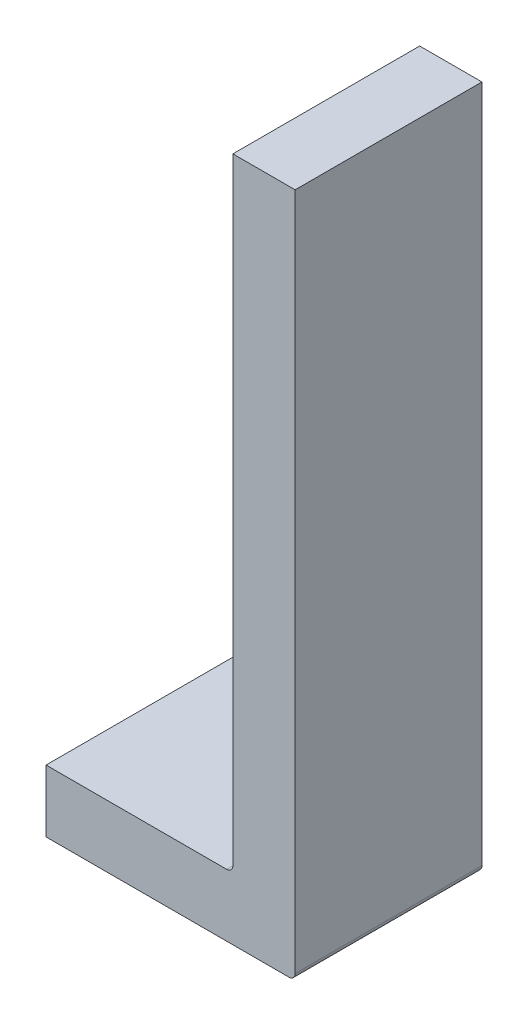
ISO-10303-21;
HEADER;
FILE_DESCRIPTION(('STEP AP214'),'2;1');
FILE_NAME('part.step','',(''),(''),'','','');
FILE_SCHEMA(('AUTOMOTIVE_DESIGN { 1 0 10303 214 1 1 1 1 }'));
ENDSEC;
DATA;
#1=APPLICATION_CONTEXT('core data for automotive mechanical design processes');
#2=APPLICATION_PROTOCOL_DEFINITION('international standard','automotive_design',2000,#1);
#3=PRODUCT_CONTEXT('',#1,'mechanical');
#4=PRODUCT('Part','Part','',(#3));
#5=PRODUCT_RELATED_PRODUCT_CATEGORY('part','',(#4));
#6=PRODUCT_DEFINITION_FORMATION('','',#4);
#7=PRODUCT_DEFINITION_CONTEXT('part definition',#1,'design');
#8=PRODUCT_DEFINITION('design','',#6,#7);
#9=PRODUCT_DEFINITION_SHAPE('','',#8);
#10=(LENGTH_UNIT() NAMED_UNIT(*) SI_UNIT(.MILLI.,.METRE.));
#11=(NAMED_UNIT(*) PLANE_ANGLE_UNIT() SI_UNIT($,.RADIAN.));
#12=(NAMED_UNIT(*) SI_UNIT($,.STERADIAN.) SOLID_ANGLE_UNIT());
#13=UNCERTAINTY_MEASURE_WITH_UNIT(LENGTH_MEASURE(1.E-05),#10,'distance_accuracy_value','');
#14=(GEOMETRIC_REPRESENTATION_CONTEXT(3) GLOBAL_UNCERTAINTY_ASSIGNED_CONTEXT((#13)) GLOBAL_UNIT_ASSIGNED_CONTEXT((#10,
#11,#12)) REPRESENTATION_CONTEXT('',''));
#15=CARTESIAN_POINT('',(0.,0.,0.));
#16=DIRECTION('',(0.,0.,1.));
#17=DIRECTION('',(1.,0.,0.));
#18=AXIS2_PLACEMENT_3D('',#15,#16,#17);
#19=CARTESIAN_POINT('',(0.,5.,0.));
#20=DIRECTION('',(1.,0.,0.));
#21=DIRECTION('',(0.,0.,-1.));
#22=AXIS2_PLACEMENT_3D('',#19,#20,#21);
#23=PLANE('',#22);
#24=DIRECTION('',(0.,0.,1.));
#25=VECTOR('',#24,1.);
#26=CARTESIAN_POINT('',(0.,0.,0.));
#27=LINE('',#26,#25);
#28=CARTESIAN_POINT('',(0.,0.,-15.));
#29=VERTEX_POINT('',#28);
#30=CARTESIAN_POINT('',(0.,0.,0.));
#31=VERTEX_POINT('',#30);
#32=EDGE_CURVE('E111',#29,#31,#27,.T.);
#33=ORIENTED_EDGE('',*,*,#32,.T.);
#34=DIRECTION('',(0.,-1.,0.));
#35=VECTOR('',#34,1.);
#36=CARTESIAN_POINT('',(0.,5.,0.));
#37=LINE('',#36,#35);
#38=CARTESIAN_POINT('',(0.,5.,0.));
#39=VERTEX_POINT('',#38);
#40=EDGE_CURVE('E168',#39,#31,#37,.T.);
#41=ORIENTED_EDGE('',*,*,#40,.F.);
#42=DIRECTION('',(0.,0.,1.));
#43=VECTOR('',#42,1.);
#44=CARTESIAN_POINT('',(0.,5.,0.));
#45=LINE('',#44,#43);
#46=CARTESIAN_POINT('',(0.,5.,-15.));
#47=VERTEX_POINT('',#46);
#48=EDGE_CURVE('E138',#47,#39,#45,.T.);
#49=ORIENTED_EDGE('',*,*,#48,.F.);
#50=DIRECTION('',(0.,-1.,0.));
#51=VECTOR('',#50,1.);
#52=CARTESIAN_POINT('',(0.,5.,-15.));
#53=LINE('',#52,#51);
#54=EDGE_CURVE('E150',#47,#29,#53,.T.);
#55=ORIENTED_EDGE('',*,*,#54,.T.);
#56=EDGE_LOOP('',(#33,#41,#49,#55));
#57=FACE_BOUND('',#56,.T.);
#58=ADVANCED_FACE('F40',(#57),#23,.F.);
#59=CARTESIAN_POINT('',(0.,5.,0.));
#60=DIRECTION('',(0.,0.,-1.));
#61=DIRECTION('',(-1.,0.,0.));
#62=AXIS2_PLACEMENT_3D('',#59,#60,#61);
#63=PLANE('',#62);
#64=DIRECTION('',(1.,0.,0.));
#65=VECTOR('',#64,1.);
#66=CARTESIAN_POINT('',(0.,0.,0.));
#67=LINE('',#66,#65);
#68=CARTESIAN_POINT('',(19.5,0.,0.));
#69=VERTEX_POINT('',#68);
#70=EDGE_CURVE('E154',#31,#69,#67,.T.);
#71=ORIENTED_EDGE('',*,*,#70,.T.);
#72=CARTESIAN_POINT('',(19.5,0.5,0.));
#73=DIRECTION('',(0.,0.,-1.));
#74=DIRECTION('',(-1.,0.,0.));
#75=AXIS2_PLACEMENT_3D('',#72,#73,#74);
#76=CIRCLE('',#75,0.5);
#77=CARTESIAN_POINT('',(20.,0.5,0.));
#78=VERTEX_POINT('',#77);
#79=EDGE_CURVE('E182',#69,#78,#76,.F.);
#80=ORIENTED_EDGE('',*,*,#79,.T.);
#81=DIRECTION('',(0.,-1.,0.));
#82=VECTOR('',#81,1.);
#83=CARTESIAN_POINT('',(20.,5.,0.));
#84=LINE('',#83,#82);
#85=CARTESIAN_POINT('',(20.,55.,0.));
#86=VERTEX_POINT('',#85);
#87=EDGE_CURVE('E119',#86,#78,#84,.T.);
#88=ORIENTED_EDGE('',*,*,#87,.F.);
#89=DIRECTION('',(1.,0.,0.));
#90=VECTOR('',#89,1.);
#91=CARTESIAN_POINT('',(0.,55.,0.));
#92=LINE('',#91,#90);
#93=CARTESIAN_POINT('',(15.,55.,0.));
#94=VERTEX_POINT('',#93);
#95=EDGE_CURVE('E115',#94,#86,#92,.T.);
#96=ORIENTED_EDGE('',*,*,#95,.F.);
#97=DIRECTION('',(0.,-1.,0.));
#98=VECTOR('',#97,1.);
#99=CARTESIAN_POINT('',(15.,55.,0.));
#100=LINE('',#99,#98);
#101=CARTESIAN_POINT('',(15.,5.5,0.));
#102=VERTEX_POINT('',#101);
#103=EDGE_CURVE('E103',#94,#102,#100,.T.);
#104=ORIENTED_EDGE('',*,*,#103,.T.);
#105=CARTESIAN_POINT('',(14.5,5.5,0.));
#106=DIRECTION('',(0.,0.,-1.));
#107=DIRECTION('',(-1.,0.,0.));
#108=AXIS2_PLACEMENT_3D('',#105,#106,#107);
#109=CIRCLE('',#108,0.5);
#110=CARTESIAN_POINT('',(14.5,5.,0.));
#111=VERTEX_POINT('',#110);
#112=EDGE_CURVE('E11',#102,#111,#109,.T.);
#113=ORIENTED_EDGE('',*,*,#112,.T.);
#114=DIRECTION('',(1.,0.,0.));
#115=VECTOR('',#114,1.);
#116=CARTESIAN_POINT('',(0.,5.,0.));
#117=LINE('',#116,#115);
#118=EDGE_CURVE('E142',#39,#111,#117,.T.);
#119=ORIENTED_EDGE('',*,*,#118,.F.);
#120=ORIENTED_EDGE('',*,*,#40,.T.);
#121=EDGE_LOOP('',(#71,#80,#88,#96,#104,#113,#119,#120));
#122=FACE_BOUND('',#121,.T.);
#123=ADVANCED_FACE('F117',(#122),#63,.F.);
#124=CARTESIAN_POINT('',(20.,5.,0.));
#125=DIRECTION('',(-1.,0.,0.));
#126=DIRECTION('',(0.,0.,1.));
#127=AXIS2_PLACEMENT_3D('',#124,#125,#126);
#128=PLANE('',#127);
#129=ORIENTED_EDGE('',*,*,#87,.T.);
#130=DIRECTION('',(0.,0.,-1.));
#131=VECTOR('',#130,1.);
#132=CARTESIAN_POINT('',(20.,0.5,-15.));
#133=LINE('',#132,#131);
#134=CARTESIAN_POINT('',(20.,0.5,-15.));
#135=VERTEX_POINT('',#134);
#136=EDGE_CURVE('E172',#78,#135,#133,.T.);
#137=ORIENTED_EDGE('',*,*,#136,.T.);
#138=DIRECTION('',(0.,-1.,0.));
#139=VECTOR('',#138,1.);
#140=CARTESIAN_POINT('',(20.,5.,-15.));
#141=LINE('',#140,#139);
#142=CARTESIAN_POINT('',(20.,55.,-15.));
#143=VERTEX_POINT('',#142);
#144=EDGE_CURVE('E162',#143,#135,#141,.T.);
#145=ORIENTED_EDGE('',*,*,#144,.F.);
#146=DIRECTION('',(0.,0.,-1.));
#147=VECTOR('',#146,1.);
#148=CARTESIAN_POINT('',(20.,55.,0.));
#149=LINE('',#148,#147);
#150=EDGE_CURVE('E124',#86,#143,#149,.T.);
#151=ORIENTED_EDGE('',*,*,#150,.F.);
#152=EDGE_LOOP('',(#129,#137,#145,#151));
#153=FACE_BOUND('',#152,.T.);
#154=ADVANCED_FACE('F215',(#153),#128,.F.);
#155=CARTESIAN_POINT('',(0.,5.,-15.));
#156=DIRECTION('',(0.,0.,1.));
#157=DIRECTION('',(1.,0.,0.));
#158=AXIS2_PLACEMENT_3D('',#155,#156,#157);
#159=PLANE('',#158);
#160=ORIENTED_EDGE('',*,*,#144,.T.);
#161=CARTESIAN_POINT('',(19.5,0.5,-15.));
#162=DIRECTION('',(0.,0.,1.));
#163=DIRECTION('',(1.,0.,0.));
#164=AXIS2_PLACEMENT_3D('',#161,#162,#163);
#165=CIRCLE('',#164,0.5);
#166=CARTESIAN_POINT('',(19.5,0.,-15.));
#167=VERTEX_POINT('',#166);
#168=EDGE_CURVE('E176',#135,#167,#165,.F.);
#169=ORIENTED_EDGE('',*,*,#168,.T.);
#170=DIRECTION('',(-1.,0.,0.));
#171=VECTOR('',#170,1.);
#172=CARTESIAN_POINT('',(0.,0.,-15.));
#173=LINE('',#172,#171);
#174=EDGE_CURVE('E143',#167,#29,#173,.T.);
#175=ORIENTED_EDGE('',*,*,#174,.T.);
#176=ORIENTED_EDGE('',*,*,#54,.F.);
#177=DIRECTION('',(-1.,0.,0.));
#178=VECTOR('',#177,1.);
#179=CARTESIAN_POINT('',(0.,5.,-15.));
#180=LINE('',#179,#178);
#181=CARTESIAN_POINT('',(14.5,5.,-15.));
#182=VERTEX_POINT('',#181);
#183=EDGE_CURVE('E147',#182,#47,#180,.T.);
#184=ORIENTED_EDGE('',*,*,#183,.F.);
#185=CARTESIAN_POINT('',(14.5,5.5,-15.));
#186=DIRECTION('',(0.,0.,1.));
#187=DIRECTION('',(1.,0.,0.));
#188=AXIS2_PLACEMENT_3D('',#185,#186,#187);
#189=CIRCLE('',#188,0.5);
#190=CARTESIAN_POINT('',(15.,5.5,-15.));
#191=VERTEX_POINT('',#190);
#192=EDGE_CURVE('E49',#182,#191,#189,.T.);
#193=ORIENTED_EDGE('',*,*,#192,.T.);
#194=DIRECTION('',(0.,-1.,0.));
#195=VECTOR('',#194,1.);
#196=CARTESIAN_POINT('',(15.,55.,-15.));
#197=LINE('',#196,#195);
#198=CARTESIAN_POINT('',(15.,55.,-15.));
#199=VERTEX_POINT('',#198);
#200=EDGE_CURVE('E112',#199,#191,#197,.T.);
#201=ORIENTED_EDGE('',*,*,#200,.F.);
#202=DIRECTION('',(-1.,0.,0.));
#203=VECTOR('',#202,1.);
#204=CARTESIAN_POINT('',(0.,55.,-15.));
#205=LINE('',#204,#203);
#206=EDGE_CURVE('E128',#143,#199,#205,.T.);
#207=ORIENTED_EDGE('',*,*,#206,.F.);
#208=EDGE_LOOP('',(#160,#169,#175,#176,#184,#193,#201,#207));
#209=FACE_BOUND('',#208,.T.);
#210=ADVANCED_FACE('F196',(#209),#159,.F.);
#211=CARTESIAN_POINT('',(0.,5.,0.));
#212=DIRECTION('',(0.,-1.,0.));
#213=DIRECTION('',(0.,0.,-1.));
#214=AXIS2_PLACEMENT_3D('',#211,#212,#213);
#215=PLANE('',#214);
#216=ORIENTED_EDGE('',*,*,#118,.T.);
#217=DIRECTION('',(0.,0.,-1.));
#218=VECTOR('',#217,1.);
#219=CARTESIAN_POINT('',(14.5,5.,0.));
#220=LINE('',#219,#218);
#221=EDGE_CURVE('E185',#111,#182,#220,.T.);
#222=ORIENTED_EDGE('',*,*,#221,.T.);
#223=ORIENTED_EDGE('',*,*,#183,.T.);
#224=ORIENTED_EDGE('',*,*,#48,.T.);
#225=EDGE_LOOP('',(#216,#222,#223,#224));
#226=FACE_BOUND('',#225,.T.);
#227=ADVANCED_FACE('F193',(#226),#215,.F.);
#228=CARTESIAN_POINT('',(0.,0.,0.));
#229=DIRECTION('',(0.,-1.,0.));
#230=DIRECTION('',(0.,0.,-1.));
#231=AXIS2_PLACEMENT_3D('',#228,#229,#230);
#232=PLANE('',#231);
#233=ORIENTED_EDGE('',*,*,#174,.F.);
#234=DIRECTION('',(0.,0.,-1.));
#235=VECTOR('',#234,1.);
#236=CARTESIAN_POINT('',(19.5,0.,0.));
#237=LINE('',#236,#235);
#238=EDGE_CURVE('E179',#167,#69,#237,.F.);
#239=ORIENTED_EDGE('',*,*,#238,.T.);
#240=ORIENTED_EDGE('',*,*,#70,.F.);
#241=ORIENTED_EDGE('',*,*,#32,.F.);
#242=EDGE_LOOP('',(#233,#239,#240,#241));
#243=FACE_BOUND('',#242,.T.);
#244=ADVANCED_FACE('F223',(#243),#232,.T.);
#245=CARTESIAN_POINT('',(15.,55.,0.));
#246=DIRECTION('',(-1.,0.,0.));
#247=DIRECTION('',(0.,0.,1.));
#248=AXIS2_PLACEMENT_3D('',#245,#246,#247);
#249=PLANE('',#248);
#250=ORIENTED_EDGE('',*,*,#200,.T.);
#251=DIRECTION('',(0.,0.,-1.));
#252=VECTOR('',#251,1.);
#253=CARTESIAN_POINT('',(15.,5.5,0.));
#254=LINE('',#253,#252);
#255=EDGE_CURVE('E62',#191,#102,#254,.F.);
#256=ORIENTED_EDGE('',*,*,#255,.T.);
#257=ORIENTED_EDGE('',*,*,#103,.F.);
#258=DIRECTION('',(0.,0.,-1.));
#259=VECTOR('',#258,1.);
#260=CARTESIAN_POINT('',(15.,55.,0.));
#261=LINE('',#260,#259);
#262=EDGE_CURVE('E107',#94,#199,#261,.T.);
#263=ORIENTED_EDGE('',*,*,#262,.T.);
#264=EDGE_LOOP('',(#250,#256,#257,#263));
#265=FACE_BOUND('',#264,.T.);
#266=ADVANCED_FACE('F105',(#265),#249,.T.);
#267=CARTESIAN_POINT('',(0.,55.,0.));
#268=DIRECTION('',(0.,1.,0.));
#269=DIRECTION('',(0.,0.,1.));
#270=AXIS2_PLACEMENT_3D('',#267,#268,#269);
#271=PLANE('',#270);
#272=ORIENTED_EDGE('',*,*,#262,.F.);
#273=ORIENTED_EDGE('',*,*,#95,.T.);
#274=ORIENTED_EDGE('',*,*,#150,.T.);
#275=ORIENTED_EDGE('',*,*,#206,.T.);
#276=EDGE_LOOP('',(#272,#273,#274,#275));
#277=FACE_BOUND('',#276,.T.);
#278=ADVANCED_FACE('F126',(#277),#271,.T.);
#279=CARTESIAN_POINT('',(19.5,0.5,0.));
#280=DIRECTION('',(0.,0.,1.));
#281=DIRECTION('',(1.,0.,0.));
#282=AXIS2_PLACEMENT_3D('',#279,#280,#281);
#283=CYLINDRICAL_SURFACE('',#282,0.5);
#284=ORIENTED_EDGE('',*,*,#79,.F.);
#285=ORIENTED_EDGE('',*,*,#238,.F.);
#286=ORIENTED_EDGE('',*,*,#168,.F.);
#287=ORIENTED_EDGE('',*,*,#136,.F.);
#288=EDGE_LOOP('',(#284,#285,#286,#287));
#289=FACE_BOUND('',#288,.T.);
#290=ADVANCED_FACE('F204',(#289),#283,.T.);
#291=CARTESIAN_POINT('',(14.5,5.5,0.));
#292=DIRECTION('',(0.,0.,-1.));
#293=DIRECTION('',(-1.,0.,0.));
#294=AXIS2_PLACEMENT_3D('',#291,#292,#293);
#295=CYLINDRICAL_SURFACE('',#294,0.5);
#296=ORIENTED_EDGE('',*,*,#112,.F.);
#297=ORIENTED_EDGE('',*,*,#255,.F.);
#298=ORIENTED_EDGE('',*,*,#192,.F.);
#299=ORIENTED_EDGE('',*,*,#221,.F.);
#300=EDGE_LOOP('',(#296,#297,#298,#299));
#301=FACE_BOUND('',#300,.T.);
#302=ADVANCED_FACE('F42',(#301),#295,.F.);
#303=CLOSED_SHELL('',(#58,#123,#154,#210,#227,#244,#266,#278,#290,#302));
#304=MANIFOLD_SOLID_BREP('B2',#303);
#305=ADVANCED_BREP_SHAPE_REPRESENTATION('',(#18,#304),#14);
#306=SHAPE_DEFINITION_REPRESENTATION(#9,#305);
ENDSEC;
END-ISO-10303-21;
